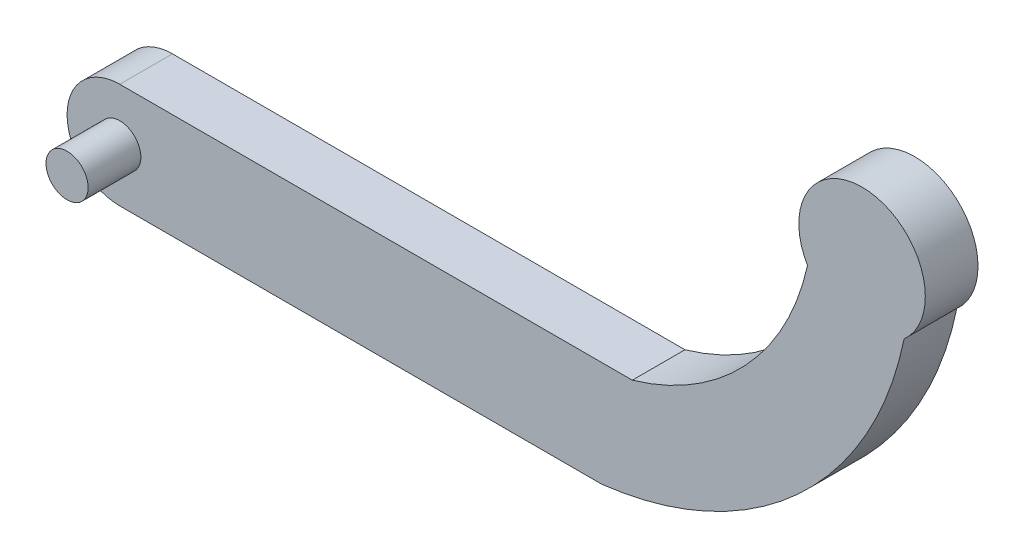
ISO-10303-21;
HEADER;
FILE_DESCRIPTION(('STEP AP214'),'2;1');
FILE_NAME('part.step','',(''),(''),'','','');
FILE_SCHEMA(('AUTOMOTIVE_DESIGN { 1 0 10303 214 1 1 1 1 }'));
ENDSEC;
DATA;
#1=APPLICATION_CONTEXT('core data for automotive mechanical design processes');
#2=APPLICATION_PROTOCOL_DEFINITION('international standard','automotive_design',2000,#1);
#3=PRODUCT_CONTEXT('',#1,'mechanical');
#4=PRODUCT('Part','Part','',(#3));
#5=PRODUCT_RELATED_PRODUCT_CATEGORY('part','',(#4));
#6=PRODUCT_DEFINITION_FORMATION('','',#4);
#7=PRODUCT_DEFINITION_CONTEXT('part definition',#1,'design');
#8=PRODUCT_DEFINITION('design','',#6,#7);
#9=PRODUCT_DEFINITION_SHAPE('','',#8);
#10=(LENGTH_UNIT() NAMED_UNIT(*) SI_UNIT(.MILLI.,.METRE.));
#11=(NAMED_UNIT(*) PLANE_ANGLE_UNIT() SI_UNIT($,.RADIAN.));
#12=(NAMED_UNIT(*) SI_UNIT($,.STERADIAN.) SOLID_ANGLE_UNIT());
#13=UNCERTAINTY_MEASURE_WITH_UNIT(LENGTH_MEASURE(1.E-05),#10,'distance_accuracy_value','');
#14=(GEOMETRIC_REPRESENTATION_CONTEXT(3) GLOBAL_UNCERTAINTY_ASSIGNED_CONTEXT((#13)) GLOBAL_UNIT_ASSIGNED_CONTEXT((#10,
#11,#12)) REPRESENTATION_CONTEXT('',''));
#15=CARTESIAN_POINT('',(0.,0.,0.));
#16=DIRECTION('',(0.,0.,1.));
#17=DIRECTION('',(1.,0.,0.));
#18=AXIS2_PLACEMENT_3D('',#15,#16,#17);
#19=CARTESIAN_POINT('',(2.03365589207616,26.163304852895,5.));
#20=DIRECTION('',(0.,0.,-1.));
#21=DIRECTION('',(-1.,0.,0.));
#22=AXIS2_PLACEMENT_3D('',#19,#20,#21);
#23=CYLINDRICAL_SURFACE('',#22,33.117232058908);
#24=CARTESIAN_POINT('',(2.03365589207616,26.163304852895,0.));
#25=DIRECTION('',(0.,0.,1.));
#26=DIRECTION('',(-1.,0.,0.));
#27=AXIS2_PLACEMENT_3D('',#24,#25,#26);
#28=CIRCLE('',#27,33.117232058908);
#29=CARTESIAN_POINT('',(5.78834827445235,-6.74039318178333,0.));
#30=VERTEX_POINT('',#29);
#31=CARTESIAN_POINT('',(34.4824546363424,19.54314478703,0.));
#32=VERTEX_POINT('',#31);
#33=EDGE_CURVE('E117',#30,#32,#28,.T.);
#34=ORIENTED_EDGE('',*,*,#33,.T.);
#35=DIRECTION('',(0.,0.,-1.));
#36=VECTOR('',#35,1.);
#37=CARTESIAN_POINT('',(34.4824546363424,19.54314478703,5.));
#38=LINE('',#37,#36);
#39=CARTESIAN_POINT('',(34.4824546363424,19.54314478703,5.));
#40=VERTEX_POINT('',#39);
#41=EDGE_CURVE('E11',#40,#32,#38,.T.);
#42=ORIENTED_EDGE('',*,*,#41,.F.);
#43=CARTESIAN_POINT('',(2.03365589207616,26.163304852895,5.));
#44=DIRECTION('',(0.,0.,1.));
#45=DIRECTION('',(-1.,0.,0.));
#46=AXIS2_PLACEMENT_3D('',#43,#44,#45);
#47=CIRCLE('',#46,33.117232058908);
#48=CARTESIAN_POINT('',(5.78834827445235,-6.74039318178333,5.));
#49=VERTEX_POINT('',#48);
#50=EDGE_CURVE('E128',#49,#40,#47,.T.);
#51=ORIENTED_EDGE('',*,*,#50,.F.);
#52=DIRECTION('',(0.,0.,-1.));
#53=VECTOR('',#52,1.);
#54=CARTESIAN_POINT('',(5.78834827445235,-6.74039318178333,5.));
#55=LINE('',#54,#53);
#56=EDGE_CURVE('E113',#49,#30,#55,.T.);
#57=ORIENTED_EDGE('',*,*,#56,.T.);
#58=EDGE_LOOP('',(#34,#42,#51,#57));
#59=FACE_BOUND('',#58,.T.);
#60=ADVANCED_FACE('F33',(#59),#23,.T.);
#61=CARTESIAN_POINT('',(30.4972644912561,24.0284830694238,5.));
#62=DIRECTION('',(0.,0.,-1.));
#63=DIRECTION('',(-1.,0.,0.));
#64=AXIS2_PLACEMENT_3D('',#61,#62,#63);
#65=CYLINDRICAL_SURFACE('',#64,6.00000000000001);
#66=CARTESIAN_POINT('',(30.4972644912561,24.0284830694238,0.));
#67=DIRECTION('',(0.,0.,1.));
#68=DIRECTION('',(-1.,0.,0.));
#69=AXIS2_PLACEMENT_3D('',#66,#67,#68);
#70=CIRCLE('',#69,6.00000000000001);
#71=CARTESIAN_POINT('',(25.319941104363,20.9961040450388,0.));
#72=VERTEX_POINT('',#71);
#73=EDGE_CURVE('E120',#32,#72,#70,.T.);
#74=ORIENTED_EDGE('',*,*,#73,.T.);
#75=DIRECTION('',(0.,0.,-1.));
#76=VECTOR('',#75,1.);
#77=CARTESIAN_POINT('',(25.319941104363,20.9961040450388,5.));
#78=LINE('',#77,#76);
#79=CARTESIAN_POINT('',(25.319941104363,20.9961040450388,5.));
#80=VERTEX_POINT('',#79);
#81=EDGE_CURVE('E41',#80,#72,#78,.T.);
#82=ORIENTED_EDGE('',*,*,#81,.F.);
#83=CARTESIAN_POINT('',(30.4972644912561,24.0284830694238,5.));
#84=DIRECTION('',(0.,0.,1.));
#85=DIRECTION('',(-1.,0.,0.));
#86=AXIS2_PLACEMENT_3D('',#83,#84,#85);
#87=CIRCLE('',#86,6.00000000000001);
#88=EDGE_CURVE('E86',#40,#80,#87,.T.);
#89=ORIENTED_EDGE('',*,*,#88,.F.);
#90=ORIENTED_EDGE('',*,*,#41,.T.);
#91=EDGE_LOOP('',(#74,#82,#89,#90));
#92=FACE_BOUND('',#91,.T.);
#93=ADVANCED_FACE('F153',(#92),#65,.T.);
#94=CARTESIAN_POINT('',(2.03365589207616,26.163304852895,5.));
#95=DIRECTION('',(0.,0.,-1.));
#96=DIRECTION('',(-1.,0.,0.));
#97=AXIS2_PLACEMENT_3D('',#94,#95,#96);
#98=CYLINDRICAL_SURFACE('',#97,23.8526946732791);
#99=CARTESIAN_POINT('',(2.03365589207616,26.163304852895,0.));
#100=DIRECTION('',(0.,0.,-1.));
#101=DIRECTION('',(-1.,0.,0.));
#102=AXIS2_PLACEMENT_3D('',#99,#100,#101);
#103=CIRCLE('',#102,23.8526946732791);
#104=CARTESIAN_POINT('',(8.69486145210441,3.25960681821668,0.));
#105=VERTEX_POINT('',#104);
#106=EDGE_CURVE('E123',#72,#105,#103,.T.);
#107=ORIENTED_EDGE('',*,*,#106,.T.);
#108=DIRECTION('',(0.,0.,-1.));
#109=VECTOR('',#108,1.);
#110=CARTESIAN_POINT('',(8.69486145210441,3.25960681821668,5.));
#111=LINE('',#110,#109);
#112=CARTESIAN_POINT('',(8.69486145210441,3.25960681821668,5.));
#113=VERTEX_POINT('',#112);
#114=EDGE_CURVE('E108',#113,#105,#111,.T.);
#115=ORIENTED_EDGE('',*,*,#114,.F.);
#116=CARTESIAN_POINT('',(2.03365589207616,26.163304852895,5.));
#117=DIRECTION('',(0.,0.,-1.));
#118=DIRECTION('',(-1.,0.,0.));
#119=AXIS2_PLACEMENT_3D('',#116,#117,#118);
#120=CIRCLE('',#119,23.8526946732791);
#121=EDGE_CURVE('E99',#80,#113,#120,.T.);
#122=ORIENTED_EDGE('',*,*,#121,.F.);
#123=ORIENTED_EDGE('',*,*,#81,.T.);
#124=EDGE_LOOP('',(#107,#115,#122,#123));
#125=FACE_BOUND('',#124,.T.);
#126=ADVANCED_FACE('F134',(#125),#98,.F.);
#127=CARTESIAN_POINT('',(8.69486145210441,3.25960681821668,5.));
#128=DIRECTION('',(0.,-1.,0.));
#129=DIRECTION('',(0.,0.,-1.));
#130=AXIS2_PLACEMENT_3D('',#127,#128,#129);
#131=PLANE('',#130);
#132=DIRECTION('',(-1.,0.,0.));
#133=VECTOR('',#132,1.);
#134=CARTESIAN_POINT('',(8.69486145210441,3.25960681821668,0.));
#135=LINE('',#134,#133);
#136=CARTESIAN_POINT('',(-39.9368537807147,3.25960681821667,0.));
#137=VERTEX_POINT('',#136);
#138=EDGE_CURVE('E107',#105,#137,#135,.T.);
#139=ORIENTED_EDGE('',*,*,#138,.T.);
#140=DIRECTION('',(0.,0.,-1.));
#141=VECTOR('',#140,1.);
#142=CARTESIAN_POINT('',(-39.9368537807147,3.25960681821667,5.));
#143=LINE('',#142,#141);
#144=CARTESIAN_POINT('',(-39.9368537807147,3.25960681821667,5.));
#145=VERTEX_POINT('',#144);
#146=EDGE_CURVE('E104',#145,#137,#143,.T.);
#147=ORIENTED_EDGE('',*,*,#146,.F.);
#148=DIRECTION('',(-1.,0.,0.));
#149=VECTOR('',#148,1.);
#150=CARTESIAN_POINT('',(8.69486145210441,3.25960681821668,5.));
#151=LINE('',#150,#149);
#152=EDGE_CURVE('E93',#113,#145,#151,.T.);
#153=ORIENTED_EDGE('',*,*,#152,.F.);
#154=ORIENTED_EDGE('',*,*,#114,.T.);
#155=EDGE_LOOP('',(#139,#147,#153,#154));
#156=FACE_BOUND('',#155,.T.);
#157=ADVANCED_FACE('F105',(#156),#131,.F.);
#158=CARTESIAN_POINT('',(-39.9368537807147,-1.74039318178333,5.));
#159=DIRECTION('',(0.,0.,-1.));
#160=DIRECTION('',(-1.,0.,0.));
#161=AXIS2_PLACEMENT_3D('',#158,#159,#160);
#162=CYLINDRICAL_SURFACE('',#161,5.);
#163=CARTESIAN_POINT('',(-39.9368537807147,-1.74039318178333,0.));
#164=DIRECTION('',(0.,0.,1.));
#165=DIRECTION('',(-1.,0.,0.));
#166=AXIS2_PLACEMENT_3D('',#163,#164,#165);
#167=CIRCLE('',#166,5.);
#168=CARTESIAN_POINT('',(-39.9368537807147,-6.74039318178333,0.));
#169=VERTEX_POINT('',#168);
#170=EDGE_CURVE('E72',#137,#169,#167,.T.);
#171=ORIENTED_EDGE('',*,*,#170,.T.);
#172=DIRECTION('',(0.,0.,-1.));
#173=VECTOR('',#172,1.);
#174=CARTESIAN_POINT('',(-39.9368537807147,-6.74039318178333,5.));
#175=LINE('',#174,#173);
#176=CARTESIAN_POINT('',(-39.9368537807147,-6.74039318178333,5.));
#177=VERTEX_POINT('',#176);
#178=EDGE_CURVE('E109',#177,#169,#175,.T.);
#179=ORIENTED_EDGE('',*,*,#178,.F.);
#180=CARTESIAN_POINT('',(-39.9368537807147,-1.74039318178333,5.));
#181=DIRECTION('',(0.,0.,1.));
#182=DIRECTION('',(-1.,0.,0.));
#183=AXIS2_PLACEMENT_3D('',#180,#181,#182);
#184=CIRCLE('',#183,5.);
#185=EDGE_CURVE('E97',#145,#177,#184,.T.);
#186=ORIENTED_EDGE('',*,*,#185,.F.);
#187=ORIENTED_EDGE('',*,*,#146,.T.);
#188=EDGE_LOOP('',(#171,#179,#186,#187));
#189=FACE_BOUND('',#188,.T.);
#190=ADVANCED_FACE('F111',(#189),#162,.T.);
#191=CARTESIAN_POINT('',(5.78834827445235,-6.74039318178333,5.));
#192=DIRECTION('',(0.,1.,0.));
#193=DIRECTION('',(0.,0.,1.));
#194=AXIS2_PLACEMENT_3D('',#191,#192,#193);
#195=PLANE('',#194);
#196=DIRECTION('',(1.,0.,0.));
#197=VECTOR('',#196,1.);
#198=CARTESIAN_POINT('',(5.78834827445235,-6.74039318178333,0.));
#199=LINE('',#198,#197);
#200=EDGE_CURVE('E78',#169,#30,#199,.T.);
#201=ORIENTED_EDGE('',*,*,#200,.T.);
#202=ORIENTED_EDGE('',*,*,#56,.F.);
#203=DIRECTION('',(1.,0.,0.));
#204=VECTOR('',#203,1.);
#205=CARTESIAN_POINT('',(5.78834827445235,-6.74039318178333,5.));
#206=LINE('',#205,#204);
#207=EDGE_CURVE('E49',#177,#49,#206,.T.);
#208=ORIENTED_EDGE('',*,*,#207,.F.);
#209=ORIENTED_EDGE('',*,*,#178,.T.);
#210=EDGE_LOOP('',(#201,#202,#208,#209));
#211=FACE_BOUND('',#210,.T.);
#212=ADVANCED_FACE('F141',(#211),#195,.F.);
#213=CARTESIAN_POINT('',(2.03365589207616,26.163304852895,5.));
#214=DIRECTION('',(0.,0.,-1.));
#215=DIRECTION('',(-1.,0.,0.));
#216=AXIS2_PLACEMENT_3D('',#213,#214,#215);
#217=PLANE('',#216);
#218=CARTESIAN_POINT('',(-39.9368537807147,-1.74039318178333,5.));
#219=DIRECTION('',(0.,0.,-1.));
#220=DIRECTION('',(-1.,0.,0.));
#221=AXIS2_PLACEMENT_3D('',#218,#219,#220);
#222=CIRCLE('',#221,2.);
#223=CARTESIAN_POINT('',(-41.9368537807147,-1.74039318178333,5.));
#224=VERTEX_POINT('',#223);
#225=EDGE_CURVE('E121',#224,#224,#222,.T.);
#226=ORIENTED_EDGE('',*,*,#225,.T.);
#227=EDGE_LOOP('',(#226));
#228=FACE_BOUND('',#227,.T.);
#229=ORIENTED_EDGE('',*,*,#50,.T.);
#230=ORIENTED_EDGE('',*,*,#88,.T.);
#231=ORIENTED_EDGE('',*,*,#121,.T.);
#232=ORIENTED_EDGE('',*,*,#152,.T.);
#233=ORIENTED_EDGE('',*,*,#185,.T.);
#234=ORIENTED_EDGE('',*,*,#207,.T.);
#235=EDGE_LOOP('',(#229,#230,#231,#232,#233,#234));
#236=FACE_BOUND('',#235,.T.);
#237=ADVANCED_FACE('F95',(#228,#236),#217,.F.);
#238=CARTESIAN_POINT('',(2.03365589207616,26.163304852895,0.));
#239=DIRECTION('',(0.,0.,-1.));
#240=DIRECTION('',(-1.,0.,0.));
#241=AXIS2_PLACEMENT_3D('',#238,#239,#240);
#242=PLANE('',#241);
#243=ORIENTED_EDGE('',*,*,#33,.F.);
#244=ORIENTED_EDGE('',*,*,#200,.F.);
#245=ORIENTED_EDGE('',*,*,#170,.F.);
#246=ORIENTED_EDGE('',*,*,#138,.F.);
#247=ORIENTED_EDGE('',*,*,#106,.F.);
#248=ORIENTED_EDGE('',*,*,#73,.F.);
#249=EDGE_LOOP('',(#243,#244,#245,#246,#247,#248));
#250=FACE_BOUND('',#249,.T.);
#251=ADVANCED_FACE('F137',(#250),#242,.T.);
#252=CARTESIAN_POINT('',(-39.9368537807147,-1.74039318178333,10.));
#253=DIRECTION('',(0.,0.,-1.));
#254=DIRECTION('',(-1.,0.,0.));
#255=AXIS2_PLACEMENT_3D('',#252,#253,#254);
#256=CYLINDRICAL_SURFACE('',#255,2.);
#257=CARTESIAN_POINT('',(-39.9368537807147,-1.74039318178333,10.));
#258=DIRECTION('',(0.,0.,-1.));
#259=DIRECTION('',(-1.,0.,0.));
#260=AXIS2_PLACEMENT_3D('',#257,#258,#259);
#261=CIRCLE('',#260,2.);
#262=CARTESIAN_POINT('',(-41.9368537807147,-1.74039318178333,10.));
#263=VERTEX_POINT('',#262);
#264=EDGE_CURVE('E214',#263,#263,#261,.T.);
#265=ORIENTED_EDGE('',*,*,#264,.T.);
#266=EDGE_LOOP('',(#265));
#267=FACE_BOUND('',#266,.T.);
#268=ORIENTED_EDGE('',*,*,#225,.F.);
#269=EDGE_LOOP('',(#268));
#270=FACE_BOUND('',#269,.T.);
#271=ADVANCED_FACE('F190',(#267,#270),#256,.T.);
#272=CARTESIAN_POINT('',(-39.9368537807147,-1.74039318178333,10.));
#273=DIRECTION('',(0.,0.,-1.));
#274=DIRECTION('',(-1.,0.,0.));
#275=AXIS2_PLACEMENT_3D('',#272,#273,#274);
#276=PLANE('',#275);
#277=ORIENTED_EDGE('',*,*,#264,.F.);
#278=EDGE_LOOP('',(#277));
#279=FACE_BOUND('',#278,.T.);
#280=ADVANCED_FACE('F198',(#279),#276,.F.);
#281=CLOSED_SHELL('',(#60,#93,#126,#157,#190,#212,#237,#251,#271,#280));
#282=MANIFOLD_SOLID_BREP('B2',#281);
#283=ADVANCED_BREP_SHAPE_REPRESENTATION('',(#18,#282),#14);
#284=SHAPE_DEFINITION_REPRESENTATION(#9,#283);
ENDSEC;
END-ISO-10303-21;
